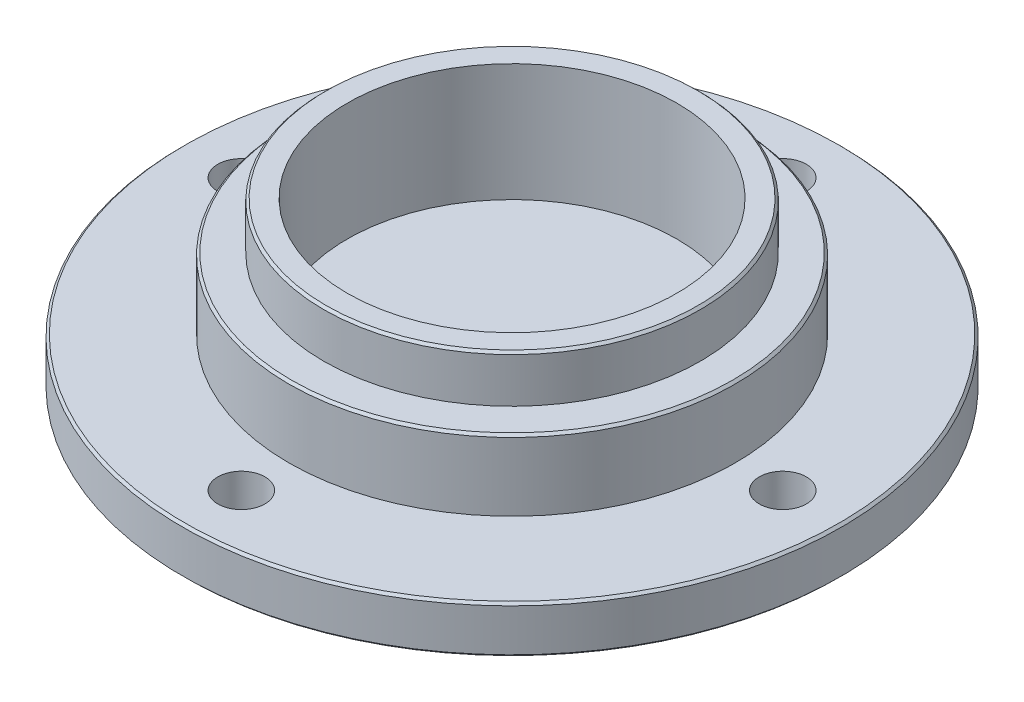
ISO-10303-21;
HEADER;
FILE_DESCRIPTION(('STEP AP214'),'2;1');
FILE_NAME('part.step','',(''),(''),'','','');
FILE_SCHEMA(('AUTOMOTIVE_DESIGN { 1 0 10303 214 1 1 1 1 }'));
ENDSEC;
DATA;
#1=APPLICATION_CONTEXT('core data for automotive mechanical design processes');
#2=APPLICATION_PROTOCOL_DEFINITION('international standard','automotive_design',2000,#1);
#3=PRODUCT_CONTEXT('',#1,'mechanical');
#4=PRODUCT('Part','Part','',(#3));
#5=PRODUCT_RELATED_PRODUCT_CATEGORY('part','',(#4));
#6=PRODUCT_DEFINITION_FORMATION('','',#4);
#7=PRODUCT_DEFINITION_CONTEXT('part definition',#1,'design');
#8=PRODUCT_DEFINITION('design','',#6,#7);
#9=PRODUCT_DEFINITION_SHAPE('','',#8);
#10=(LENGTH_UNIT() NAMED_UNIT(*) SI_UNIT(.MILLI.,.METRE.));
#11=(NAMED_UNIT(*) PLANE_ANGLE_UNIT() SI_UNIT($,.RADIAN.));
#12=(NAMED_UNIT(*) SI_UNIT($,.STERADIAN.) SOLID_ANGLE_UNIT());
#13=UNCERTAINTY_MEASURE_WITH_UNIT(LENGTH_MEASURE(1.E-05),#10,'distance_accuracy_value','');
#14=(GEOMETRIC_REPRESENTATION_CONTEXT(3) GLOBAL_UNCERTAINTY_ASSIGNED_CONTEXT((#13)) GLOBAL_UNIT_ASSIGNED_CONTEXT((#10,
#11,#12)) REPRESENTATION_CONTEXT('',''));
#15=CARTESIAN_POINT('',(0.,0.,0.));
#16=DIRECTION('',(0.,0.,1.));
#17=DIRECTION('',(1.,0.,0.));
#18=AXIS2_PLACEMENT_3D('',#15,#16,#17);
#19=CARTESIAN_POINT('',(0.,15.,0.));
#20=DIRECTION('',(0.,-1.,0.));
#21=DIRECTION('',(0.,0.,-1.));
#22=AXIS2_PLACEMENT_3D('',#19,#20,#21);
#23=CYLINDRICAL_SURFACE('',#22,47.4);
#24=CARTESIAN_POINT('',(0.,14.5,0.));
#25=DIRECTION('',(0.,1.,0.));
#26=DIRECTION('',(0.,0.,1.));
#27=AXIS2_PLACEMENT_3D('',#24,#25,#26);
#28=CIRCLE('',#27,47.4);
#29=CARTESIAN_POINT('',(0.,14.5,47.4));
#30=VERTEX_POINT('',#29);
#31=EDGE_CURVE('E56',#30,#30,#28,.F.);
#32=ORIENTED_EDGE('',*,*,#31,.T.);
#33=EDGE_LOOP('',(#32));
#34=FACE_BOUND('',#33,.T.);
#35=CARTESIAN_POINT('',(0.,0.,0.));
#36=DIRECTION('',(0.,1.,0.));
#37=DIRECTION('',(0.,0.,1.));
#38=AXIS2_PLACEMENT_3D('',#35,#36,#37);
#39=CIRCLE('',#38,47.4);
#40=CARTESIAN_POINT('',(0.,0.,47.4));
#41=VERTEX_POINT('',#40);
#42=EDGE_CURVE('E69',#41,#41,#39,.T.);
#43=ORIENTED_EDGE('',*,*,#42,.T.);
#44=EDGE_LOOP('',(#43));
#45=FACE_BOUND('',#44,.T.);
#46=ADVANCED_FACE('F35',(#34,#45),#23,.T.);
#47=CARTESIAN_POINT('',(0.,15.,0.));
#48=DIRECTION('',(0.,1.,0.));
#49=DIRECTION('',(0.,0.,1.));
#50=AXIS2_PLACEMENT_3D('',#47,#48,#49);
#51=PLANE('',#50);
#52=CARTESIAN_POINT('',(0.,15.,0.));
#53=DIRECTION('',(0.,1.,0.));
#54=DIRECTION('',(0.,0.,1.));
#55=AXIS2_PLACEMENT_3D('',#52,#53,#54);
#56=CIRCLE('',#55,46.9);
#57=CARTESIAN_POINT('',(0.,15.,46.9));
#58=VERTEX_POINT('',#57);
#59=EDGE_CURVE('E59',#58,#58,#56,.T.);
#60=ORIENTED_EDGE('',*,*,#59,.T.);
#61=EDGE_LOOP('',(#60));
#62=FACE_BOUND('',#61,.T.);
#63=CARTESIAN_POINT('',(0.,15.,0.));
#64=DIRECTION('',(0.,1.,0.));
#65=DIRECTION('',(0.,0.,1.));
#66=AXIS2_PLACEMENT_3D('',#63,#64,#65);
#67=CIRCLE('',#66,40.);
#68=CARTESIAN_POINT('',(0.,15.,40.));
#69=VERTEX_POINT('',#68);
#70=EDGE_CURVE('E68',#69,#69,#67,.T.);
#71=ORIENTED_EDGE('',*,*,#70,.F.);
#72=EDGE_LOOP('',(#71));
#73=FACE_BOUND('',#72,.T.);
#74=ADVANCED_FACE('F126',(#62,#73),#51,.T.);
#75=CARTESIAN_POINT('',(0.,25.,0.));
#76=DIRECTION('',(0.,-1.,0.));
#77=DIRECTION('',(0.,0.,-1.));
#78=AXIS2_PLACEMENT_3D('',#75,#76,#77);
#79=CYLINDRICAL_SURFACE('',#78,40.);
#80=CARTESIAN_POINT('',(0.,24.5,0.));
#81=DIRECTION('',(0.,1.,0.));
#82=DIRECTION('',(0.,0.,1.));
#83=AXIS2_PLACEMENT_3D('',#80,#81,#82);
#84=CIRCLE('',#83,40.);
#85=CARTESIAN_POINT('',(0.,24.5,40.));
#86=VERTEX_POINT('',#85);
#87=EDGE_CURVE('E62',#86,#86,#84,.F.);
#88=ORIENTED_EDGE('',*,*,#87,.T.);
#89=EDGE_LOOP('',(#88));
#90=FACE_BOUND('',#89,.T.);
#91=ORIENTED_EDGE('',*,*,#70,.T.);
#92=EDGE_LOOP('',(#91));
#93=FACE_BOUND('',#92,.T.);
#94=ADVANCED_FACE('F117',(#90,#93),#79,.T.);
#95=CARTESIAN_POINT('',(0.,25.,0.));
#96=DIRECTION('',(0.,1.,0.));
#97=DIRECTION('',(0.,0.,1.));
#98=AXIS2_PLACEMENT_3D('',#95,#96,#97);
#99=PLANE('',#98);
#100=CARTESIAN_POINT('',(0.,25.,0.));
#101=DIRECTION('',(0.,1.,0.));
#102=DIRECTION('',(0.,0.,1.));
#103=AXIS2_PLACEMENT_3D('',#100,#101,#102);
#104=CIRCLE('',#103,39.5);
#105=CARTESIAN_POINT('',(0.,25.,39.5));
#106=VERTEX_POINT('',#105);
#107=EDGE_CURVE('E65',#106,#106,#104,.T.);
#108=ORIENTED_EDGE('',*,*,#107,.T.);
#109=EDGE_LOOP('',(#108));
#110=FACE_BOUND('',#109,.T.);
#111=CARTESIAN_POINT('',(0.,25.,0.));
#112=DIRECTION('',(0.,1.,0.));
#113=DIRECTION('',(0.,0.,1.));
#114=AXIS2_PLACEMENT_3D('',#111,#112,#113);
#115=CIRCLE('',#114,35.);
#116=CARTESIAN_POINT('',(0.,25.,35.));
#117=VERTEX_POINT('',#116);
#118=EDGE_CURVE('E99',#117,#117,#115,.T.);
#119=ORIENTED_EDGE('',*,*,#118,.F.);
#120=EDGE_LOOP('',(#119));
#121=FACE_BOUND('',#120,.T.);
#122=ADVANCED_FACE('F114',(#110,#121),#99,.T.);
#123=CARTESIAN_POINT('',(0.,-10.,0.));
#124=DIRECTION('',(0.,-1.,0.));
#125=DIRECTION('',(0.,0.,-1.));
#126=AXIS2_PLACEMENT_3D('',#123,#124,#125);
#127=PLANE('',#126);
#128=CARTESIAN_POINT('',(0.,-10.,0.));
#129=DIRECTION('',(0.,-1.,0.));
#130=DIRECTION('',(0.,0.,-1.));
#131=AXIS2_PLACEMENT_3D('',#128,#129,#130);
#132=CIRCLE('',#131,69.5);
#133=CARTESIAN_POINT('',(0.,-10.,-69.5));
#134=VERTEX_POINT('',#133);
#135=EDGE_CURVE('E10',#134,#134,#132,.T.);
#136=ORIENTED_EDGE('',*,*,#135,.T.);
#137=EDGE_LOOP('',(#136));
#138=FACE_BOUND('',#137,.T.);
#139=CARTESIAN_POINT('',(0.,-10.,-57.5));
#140=DIRECTION('',(0.,-1.,0.));
#141=DIRECTION('',(0.,0.,-1.));
#142=AXIS2_PLACEMENT_3D('',#139,#140,#141);
#143=CIRCLE('',#142,5.00000000000309);
#144=CARTESIAN_POINT('',(0.,-10.,-62.5000000000031));
#145=VERTEX_POINT('',#144);
#146=EDGE_CURVE('E84',#145,#145,#143,.T.);
#147=ORIENTED_EDGE('',*,*,#146,.F.);
#148=EDGE_LOOP('',(#147));
#149=FACE_BOUND('',#148,.T.);
#150=CARTESIAN_POINT('',(0.,-10.,57.5));
#151=DIRECTION('',(0.,-1.,0.));
#152=DIRECTION('',(0.,0.,-1.));
#153=AXIS2_PLACEMENT_3D('',#150,#151,#152);
#154=CIRCLE('',#153,5.);
#155=CARTESIAN_POINT('',(0.,-10.,52.5));
#156=VERTEX_POINT('',#155);
#157=EDGE_CURVE('E72',#156,#156,#154,.T.);
#158=ORIENTED_EDGE('',*,*,#157,.F.);
#159=EDGE_LOOP('',(#158));
#160=FACE_BOUND('',#159,.T.);
#161=CARTESIAN_POINT('',(57.5,-10.,0.));
#162=DIRECTION('',(0.,-1.,0.));
#163=DIRECTION('',(0.,0.,-1.));
#164=AXIS2_PLACEMENT_3D('',#161,#162,#163);
#165=CIRCLE('',#164,5.00000000000202);
#166=CARTESIAN_POINT('',(57.5,-10.,-5.00000000000202));
#167=VERTEX_POINT('',#166);
#168=EDGE_CURVE('E78',#167,#167,#165,.T.);
#169=ORIENTED_EDGE('',*,*,#168,.F.);
#170=EDGE_LOOP('',(#169));
#171=FACE_BOUND('',#170,.T.);
#172=CARTESIAN_POINT('',(-57.5,-10.,0.));
#173=DIRECTION('',(0.,-1.,0.));
#174=DIRECTION('',(0.,0.,-1.));
#175=AXIS2_PLACEMENT_3D('',#172,#173,#174);
#176=CIRCLE('',#175,5.00000000000084);
#177=CARTESIAN_POINT('',(-57.5,-10.,-5.00000000000085));
#178=VERTEX_POINT('',#177);
#179=EDGE_CURVE('E90',#178,#178,#176,.T.);
#180=ORIENTED_EDGE('',*,*,#179,.F.);
#181=EDGE_LOOP('',(#180));
#182=FACE_BOUND('',#181,.T.);
#183=ADVANCED_FACE('F116',(#138,#149,#160,#171,#182),#127,.T.);
#184=CARTESIAN_POINT('',(0.,0.,0.));
#185=DIRECTION('',(0.,-1.,0.));
#186=DIRECTION('',(0.,0.,-1.));
#187=AXIS2_PLACEMENT_3D('',#184,#185,#186);
#188=PLANE('',#187);
#189=CARTESIAN_POINT('',(0.,0.,0.));
#190=DIRECTION('',(0.,-1.,0.));
#191=DIRECTION('',(0.,0.,-1.));
#192=AXIS2_PLACEMENT_3D('',#189,#190,#191);
#193=CIRCLE('',#192,69.5);
#194=CARTESIAN_POINT('',(0.,0.,-69.5));
#195=VERTEX_POINT('',#194);
#196=EDGE_CURVE('E43',#195,#195,#193,.F.);
#197=ORIENTED_EDGE('',*,*,#196,.T.);
#198=EDGE_LOOP('',(#197));
#199=FACE_BOUND('',#198,.T.);
#200=ORIENTED_EDGE('',*,*,#42,.F.);
#201=EDGE_LOOP('',(#200));
#202=FACE_BOUND('',#201,.T.);
#203=CARTESIAN_POINT('',(0.,0.,57.5));
#204=DIRECTION('',(0.,-1.,0.));
#205=DIRECTION('',(0.,0.,-1.));
#206=AXIS2_PLACEMENT_3D('',#203,#204,#205);
#207=CIRCLE('',#206,5.);
#208=CARTESIAN_POINT('',(0.,0.,52.5));
#209=VERTEX_POINT('',#208);
#210=EDGE_CURVE('E75',#209,#209,#207,.T.);
#211=ORIENTED_EDGE('',*,*,#210,.T.);
#212=EDGE_LOOP('',(#211));
#213=FACE_BOUND('',#212,.T.);
#214=CARTESIAN_POINT('',(57.5,0.,0.));
#215=DIRECTION('',(0.,-1.,0.));
#216=DIRECTION('',(0.,0.,-1.));
#217=AXIS2_PLACEMENT_3D('',#214,#215,#216);
#218=CIRCLE('',#217,5.00000000000202);
#219=CARTESIAN_POINT('',(57.5,0.,-5.00000000000202));
#220=VERTEX_POINT('',#219);
#221=EDGE_CURVE('E81',#220,#220,#218,.T.);
#222=ORIENTED_EDGE('',*,*,#221,.T.);
#223=EDGE_LOOP('',(#222));
#224=FACE_BOUND('',#223,.T.);
#225=CARTESIAN_POINT('',(0.,0.,-57.5));
#226=DIRECTION('',(0.,-1.,0.));
#227=DIRECTION('',(0.,0.,-1.));
#228=AXIS2_PLACEMENT_3D('',#225,#226,#227);
#229=CIRCLE('',#228,5.00000000000309);
#230=CARTESIAN_POINT('',(0.,0.,-62.5000000000031));
#231=VERTEX_POINT('',#230);
#232=EDGE_CURVE('E87',#231,#231,#229,.T.);
#233=ORIENTED_EDGE('',*,*,#232,.T.);
#234=EDGE_LOOP('',(#233));
#235=FACE_BOUND('',#234,.T.);
#236=CARTESIAN_POINT('',(-57.5,0.,0.));
#237=DIRECTION('',(0.,-1.,0.));
#238=DIRECTION('',(0.,0.,-1.));
#239=AXIS2_PLACEMENT_3D('',#236,#237,#238);
#240=CIRCLE('',#239,5.00000000000084);
#241=CARTESIAN_POINT('',(-57.5,0.,-5.00000000000085));
#242=VERTEX_POINT('',#241);
#243=EDGE_CURVE('E93',#242,#242,#240,.T.);
#244=ORIENTED_EDGE('',*,*,#243,.T.);
#245=EDGE_LOOP('',(#244));
#246=FACE_BOUND('',#245,.T.);
#247=ADVANCED_FACE('F124',(#199,#202,#213,#224,#235,#246),#188,.F.);
#248=CARTESIAN_POINT('',(0.,-10.,0.));
#249=DIRECTION('',(0.,1.,0.));
#250=DIRECTION('',(0.,0.,1.));
#251=AXIS2_PLACEMENT_3D('',#248,#249,#250);
#252=CYLINDRICAL_SURFACE('',#251,70.);
#253=CARTESIAN_POINT('',(0.,-0.500000000000014,0.));
#254=DIRECTION('',(0.,-1.,0.));
#255=DIRECTION('',(0.,0.,-1.));
#256=AXIS2_PLACEMENT_3D('',#253,#254,#255);
#257=CIRCLE('',#256,70.);
#258=CARTESIAN_POINT('',(0.,-0.500000000000014,-70.));
#259=VERTEX_POINT('',#258);
#260=EDGE_CURVE('E47',#259,#259,#257,.T.);
#261=ORIENTED_EDGE('',*,*,#260,.T.);
#262=EDGE_LOOP('',(#261));
#263=FACE_BOUND('',#262,.T.);
#264=CARTESIAN_POINT('',(0.,-9.49999999999997,0.));
#265=DIRECTION('',(0.,-1.,0.));
#266=DIRECTION('',(0.,0.,-1.));
#267=AXIS2_PLACEMENT_3D('',#264,#265,#266);
#268=CIRCLE('',#267,70.);
#269=CARTESIAN_POINT('',(0.,-9.49999999999997,-70.));
#270=VERTEX_POINT('',#269);
#271=EDGE_CURVE('E51',#270,#270,#268,.F.);
#272=ORIENTED_EDGE('',*,*,#271,.T.);
#273=EDGE_LOOP('',(#272));
#274=FACE_BOUND('',#273,.T.);
#275=ADVANCED_FACE('F166',(#263,#274),#252,.T.);
#276=CARTESIAN_POINT('',(0.,-10.,57.5));
#277=DIRECTION('',(0.,1.,0.));
#278=DIRECTION('',(0.,0.,1.));
#279=AXIS2_PLACEMENT_3D('',#276,#277,#278);
#280=CYLINDRICAL_SURFACE('',#279,5.);
#281=ORIENTED_EDGE('',*,*,#157,.T.);
#282=EDGE_LOOP('',(#281));
#283=FACE_BOUND('',#282,.T.);
#284=ORIENTED_EDGE('',*,*,#210,.F.);
#285=EDGE_LOOP('',(#284));
#286=FACE_BOUND('',#285,.T.);
#287=ADVANCED_FACE('F169',(#283,#286),#280,.F.);
#288=CARTESIAN_POINT('',(57.5,-10.,0.));
#289=DIRECTION('',(0.,1.,0.));
#290=DIRECTION('',(0.,0.,1.));
#291=AXIS2_PLACEMENT_3D('',#288,#289,#290);
#292=CYLINDRICAL_SURFACE('',#291,5.00000000000202);
#293=ORIENTED_EDGE('',*,*,#168,.T.);
#294=EDGE_LOOP('',(#293));
#295=FACE_BOUND('',#294,.T.);
#296=ORIENTED_EDGE('',*,*,#221,.F.);
#297=EDGE_LOOP('',(#296));
#298=FACE_BOUND('',#297,.T.);
#299=ADVANCED_FACE('F176',(#295,#298),#292,.F.);
#300=CARTESIAN_POINT('',(0.,-10.,-57.5));
#301=DIRECTION('',(0.,1.,0.));
#302=DIRECTION('',(0.,0.,1.));
#303=AXIS2_PLACEMENT_3D('',#300,#301,#302);
#304=CYLINDRICAL_SURFACE('',#303,5.00000000000309);
#305=ORIENTED_EDGE('',*,*,#146,.T.);
#306=EDGE_LOOP('',(#305));
#307=FACE_BOUND('',#306,.T.);
#308=ORIENTED_EDGE('',*,*,#232,.F.);
#309=EDGE_LOOP('',(#308));
#310=FACE_BOUND('',#309,.T.);
#311=ADVANCED_FACE('F183',(#307,#310),#304,.F.);
#312=CARTESIAN_POINT('',(-57.5,-10.,0.));
#313=DIRECTION('',(0.,1.,0.));
#314=DIRECTION('',(0.,0.,1.));
#315=AXIS2_PLACEMENT_3D('',#312,#313,#314);
#316=CYLINDRICAL_SURFACE('',#315,5.00000000000084);
#317=ORIENTED_EDGE('',*,*,#179,.T.);
#318=EDGE_LOOP('',(#317));
#319=FACE_BOUND('',#318,.T.);
#320=ORIENTED_EDGE('',*,*,#243,.F.);
#321=EDGE_LOOP('',(#320));
#322=FACE_BOUND('',#321,.T.);
#323=ADVANCED_FACE('F110',(#319,#322),#316,.F.);
#324=CARTESIAN_POINT('',(0.,0.,0.));
#325=DIRECTION('',(0.,1.,0.));
#326=DIRECTION('',(0.,0.,1.));
#327=AXIS2_PLACEMENT_3D('',#324,#325,#326);
#328=CYLINDRICAL_SURFACE('',#327,35.);
#329=CARTESIAN_POINT('',(0.,0.,0.));
#330=DIRECTION('',(0.,1.,0.));
#331=DIRECTION('',(0.,0.,1.));
#332=AXIS2_PLACEMENT_3D('',#329,#330,#331);
#333=CIRCLE('',#332,35.);
#334=CARTESIAN_POINT('',(0.,0.,35.));
#335=VERTEX_POINT('',#334);
#336=EDGE_CURVE('E96',#335,#335,#333,.T.);
#337=ORIENTED_EDGE('',*,*,#336,.F.);
#338=EDGE_LOOP('',(#337));
#339=FACE_BOUND('',#338,.T.);
#340=ORIENTED_EDGE('',*,*,#118,.T.);
#341=EDGE_LOOP('',(#340));
#342=FACE_BOUND('',#341,.T.);
#343=ADVANCED_FACE('F107',(#339,#342),#328,.F.);
#344=CARTESIAN_POINT('',(0.,0.,0.));
#345=DIRECTION('',(0.,1.,0.));
#346=DIRECTION('',(0.,0.,1.));
#347=AXIS2_PLACEMENT_3D('',#344,#345,#346);
#348=PLANE('',#347);
#349=ORIENTED_EDGE('',*,*,#336,.T.);
#350=EDGE_LOOP('',(#349));
#351=FACE_BOUND('',#350,.T.);
#352=ADVANCED_FACE('F105',(#351),#348,.T.);
#353=CARTESIAN_POINT('',(0.,25.,0.));
#354=DIRECTION('',(0.,-1.,0.));
#355=DIRECTION('',(0.,0.,-1.));
#356=AXIS2_PLACEMENT_3D('',#353,#354,#355);
#357=CONICAL_SURFACE('',#356,39.5,0.785398163397448);
#358=ORIENTED_EDGE('',*,*,#87,.F.);
#359=EDGE_LOOP('',(#358));
#360=FACE_BOUND('',#359,.T.);
#361=ORIENTED_EDGE('',*,*,#107,.F.);
#362=EDGE_LOOP('',(#361));
#363=FACE_BOUND('',#362,.T.);
#364=ADVANCED_FACE('F141',(#360,#363),#357,.T.);
#365=CARTESIAN_POINT('',(0.,15.,0.));
#366=DIRECTION('',(0.,-1.,0.));
#367=DIRECTION('',(0.,0.,-1.));
#368=AXIS2_PLACEMENT_3D('',#365,#366,#367);
#369=CONICAL_SURFACE('',#368,46.9,0.785398163397448);
#370=ORIENTED_EDGE('',*,*,#31,.F.);
#371=EDGE_LOOP('',(#370));
#372=FACE_BOUND('',#371,.T.);
#373=ORIENTED_EDGE('',*,*,#59,.F.);
#374=EDGE_LOOP('',(#373));
#375=FACE_BOUND('',#374,.T.);
#376=ADVANCED_FACE('F147',(#372,#375),#369,.T.);
#377=CARTESIAN_POINT('',(0.,-0.500000000000014,0.));
#378=DIRECTION('',(0.,-1.,0.));
#379=DIRECTION('',(0.,0.,-1.));
#380=AXIS2_PLACEMENT_3D('',#377,#378,#379);
#381=CONICAL_SURFACE('',#380,70.,0.785398163397435);
#382=ORIENTED_EDGE('',*,*,#196,.F.);
#383=EDGE_LOOP('',(#382));
#384=FACE_BOUND('',#383,.T.);
#385=ORIENTED_EDGE('',*,*,#260,.F.);
#386=EDGE_LOOP('',(#385));
#387=FACE_BOUND('',#386,.T.);
#388=ADVANCED_FACE('F153',(#384,#387),#381,.T.);
#389=CARTESIAN_POINT('',(0.,-10.,0.));
#390=DIRECTION('',(0.,1.,0.));
#391=DIRECTION('',(0.,0.,1.));
#392=AXIS2_PLACEMENT_3D('',#389,#390,#391);
#393=CONICAL_SURFACE('',#392,69.5,0.785398163397462);
#394=ORIENTED_EDGE('',*,*,#271,.F.);
#395=EDGE_LOOP('',(#394));
#396=FACE_BOUND('',#395,.T.);
#397=ORIENTED_EDGE('',*,*,#135,.F.);
#398=EDGE_LOOP('',(#397));
#399=FACE_BOUND('',#398,.T.);
#400=ADVANCED_FACE('F38',(#396,#399),#393,.T.);
#401=CLOSED_SHELL('',(#46,#74,#94,#122,#183,#247,#275,#287,#299,#311,#323,#343,#352,#364,#376,
#388,#400));
#402=MANIFOLD_SOLID_BREP('B2',#401);
#403=ADVANCED_BREP_SHAPE_REPRESENTATION('',(#18,#402),#14);
#404=SHAPE_DEFINITION_REPRESENTATION(#9,#403);
ENDSEC;
END-ISO-10303-21;
